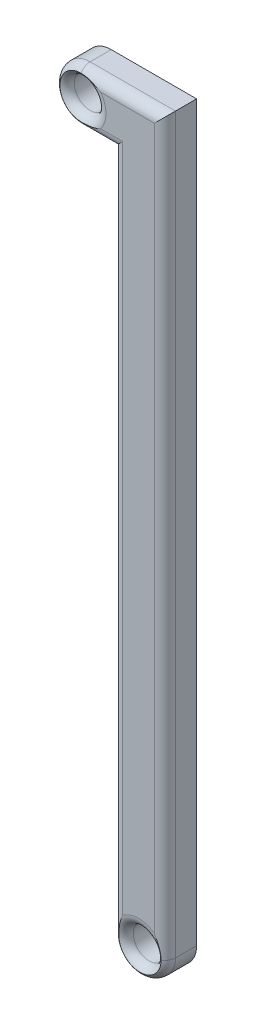
ISO-10303-21;
HEADER;
FILE_DESCRIPTION(('STEP AP214'),'2;1');
FILE_NAME('part.step','',(''),(''),'','','');
FILE_SCHEMA(('AUTOMOTIVE_DESIGN { 1 0 10303 214 1 1 1 1 }'));
ENDSEC;
DATA;
#1=APPLICATION_CONTEXT('core data for automotive mechanical design processes');
#2=APPLICATION_PROTOCOL_DEFINITION('international standard','automotive_design',2000,#1);
#3=PRODUCT_CONTEXT('',#1,'mechanical');
#4=PRODUCT('Part','Part','',(#3));
#5=PRODUCT_RELATED_PRODUCT_CATEGORY('part','',(#4));
#6=PRODUCT_DEFINITION_FORMATION('','',#4);
#7=PRODUCT_DEFINITION_CONTEXT('part definition',#1,'design');
#8=PRODUCT_DEFINITION('design','',#6,#7);
#9=PRODUCT_DEFINITION_SHAPE('','',#8);
#10=(LENGTH_UNIT() NAMED_UNIT(*) SI_UNIT(.MILLI.,.METRE.));
#11=(NAMED_UNIT(*) PLANE_ANGLE_UNIT() SI_UNIT($,.RADIAN.));
#12=(NAMED_UNIT(*) SI_UNIT($,.STERADIAN.) SOLID_ANGLE_UNIT());
#13=UNCERTAINTY_MEASURE_WITH_UNIT(LENGTH_MEASURE(1.E-05),#10,'distance_accuracy_value','');
#14=(GEOMETRIC_REPRESENTATION_CONTEXT(3) GLOBAL_UNCERTAINTY_ASSIGNED_CONTEXT((#13)) GLOBAL_UNIT_ASSIGNED_CONTEXT((#10,
#11,#12)) REPRESENTATION_CONTEXT('',''));
#15=CARTESIAN_POINT('',(0.,0.,0.));
#16=DIRECTION('',(0.,0.,1.));
#17=DIRECTION('',(1.,0.,0.));
#18=AXIS2_PLACEMENT_3D('',#15,#16,#17);
#19=CARTESIAN_POINT('',(3.23116737382815,-1.99988934751613,3.));
#20=DIRECTION('',(0.,0.,-1.));
#21=DIRECTION('',(-1.,0.,0.));
#22=AXIS2_PLACEMENT_3D('',#19,#20,#21);
#23=PLANE('',#22);
#24=DIRECTION('',(0.,1.,0.));
#25=VECTOR('',#24,1.);
#26=CARTESIAN_POINT('',(10.3211673738282,-1.99988934751613,3.));
#27=LINE('',#26,#25);
#28=CARTESIAN_POINT('',(10.3211673738282,-66.9998893475161,3.));
#29=VERTEX_POINT('',#28);
#30=CARTESIAN_POINT('',(10.3211673738282,-0.499889347516129,3.));
#31=VERTEX_POINT('',#30);
#32=EDGE_CURVE('E264',#29,#31,#27,.T.);
#33=ORIENTED_EDGE('',*,*,#32,.T.);
#34=DIRECTION('',(-1.,0.,0.));
#35=VECTOR('',#34,1.);
#36=CARTESIAN_POINT('',(3.23116737382815,-0.499889347516129,3.));
#37=LINE('',#36,#35);
#38=CARTESIAN_POINT('',(5.23116737382815,-0.499889347516129,3.));
#39=VERTEX_POINT('',#38);
#40=EDGE_CURVE('E266',#31,#39,#37,.T.);
#41=ORIENTED_EDGE('',*,*,#40,.T.);
#42=CARTESIAN_POINT('',(3.23116737382815,-1.99988934751613,3.));
#43=DIRECTION('',(0.,0.,-1.));
#44=DIRECTION('',(-1.,0.,0.));
#45=AXIS2_PLACEMENT_3D('',#42,#43,#44);
#46=CIRCLE('',#45,2.5);
#47=CARTESIAN_POINT('',(5.23116737382815,-3.49988934751613,3.));
#48=VERTEX_POINT('',#47);
#49=EDGE_CURVE('E259',#39,#48,#46,.T.);
#50=ORIENTED_EDGE('',*,*,#49,.T.);
#51=DIRECTION('',(1.,0.,0.));
#52=VECTOR('',#51,1.);
#53=CARTESIAN_POINT('',(3.23116737382815,-3.49988934751613,3.));
#54=LINE('',#53,#52);
#55=CARTESIAN_POINT('',(7.32116737382815,-3.49988934751613,3.));
#56=VERTEX_POINT('',#55);
#57=EDGE_CURVE('E255',#48,#56,#54,.T.);
#58=ORIENTED_EDGE('',*,*,#57,.T.);
#59=DIRECTION('',(0.,-1.,0.));
#60=VECTOR('',#59,1.);
#61=CARTESIAN_POINT('',(7.32116737382815,-1.99988934751613,3.));
#62=LINE('',#61,#60);
#63=CARTESIAN_POINT('',(7.32116737382816,-66.9998893475161,3.));
#64=VERTEX_POINT('',#63);
#65=EDGE_CURVE('E257',#56,#64,#62,.T.);
#66=ORIENTED_EDGE('',*,*,#65,.T.);
#67=CARTESIAN_POINT('',(8.82116737382816,-68.9998893475161,3.));
#68=DIRECTION('',(0.,0.,-1.));
#69=DIRECTION('',(-1.,0.,0.));
#70=AXIS2_PLACEMENT_3D('',#67,#68,#69);
#71=CIRCLE('',#70,2.5);
#72=EDGE_CURVE('E261',#64,#29,#71,.T.);
#73=ORIENTED_EDGE('',*,*,#72,.T.);
#74=EDGE_LOOP('',(#33,#41,#50,#58,#66,#73));
#75=FACE_BOUND('',#74,.T.);
#76=ADVANCED_FACE('F33',(#75),#23,.F.);
#77=CARTESIAN_POINT('',(3.23116737382815,-1.99988934751613,0.));
#78=DIRECTION('',(0.,0.,-1.));
#79=DIRECTION('',(-1.,0.,0.));
#80=AXIS2_PLACEMENT_3D('',#77,#78,#79);
#81=PLANE('',#80);
#82=CARTESIAN_POINT('',(3.23116737382815,-1.99988934751613,0.));
#83=DIRECTION('',(0.,0.,1.));
#84=DIRECTION('',(1.,0.,0.));
#85=AXIS2_PLACEMENT_3D('',#82,#83,#84);
#86=CIRCLE('',#85,1.5);
#87=CARTESIAN_POINT('',(4.73116737382815,-1.99988934751613,0.));
#88=VERTEX_POINT('',#87);
#89=EDGE_CURVE('E296',#88,#88,#86,.T.);
#90=ORIENTED_EDGE('',*,*,#89,.T.);
#91=EDGE_LOOP('',(#90));
#92=FACE_BOUND('',#91,.T.);
#93=CARTESIAN_POINT('',(3.23116737382815,-1.99988934751613,0.));
#94=DIRECTION('',(0.,0.,1.));
#95=DIRECTION('',(-1.,0.,0.));
#96=AXIS2_PLACEMENT_3D('',#93,#94,#95);
#97=CIRCLE('',#96,2.5);
#98=CARTESIAN_POINT('',(3.23116737382815,0.500110652483871,0.));
#99=VERTEX_POINT('',#98);
#100=CARTESIAN_POINT('',(3.23116737382815,-4.49988934751613,0.));
#101=VERTEX_POINT('',#100);
#102=EDGE_CURVE('E299',#99,#101,#97,.T.);
#103=ORIENTED_EDGE('',*,*,#102,.F.);
#104=DIRECTION('',(-1.,0.,0.));
#105=VECTOR('',#104,1.);
#106=CARTESIAN_POINT('',(3.23116737382815,0.500110652483871,0.));
#107=LINE('',#106,#105);
#108=CARTESIAN_POINT('',(11.3211673738282,0.500110652483871,0.));
#109=VERTEX_POINT('',#108);
#110=EDGE_CURVE('E240',#109,#99,#107,.T.);
#111=ORIENTED_EDGE('',*,*,#110,.F.);
#112=DIRECTION('',(0.,1.,0.));
#113=VECTOR('',#112,1.);
#114=CARTESIAN_POINT('',(11.3211673738282,0.500110652483871,0.));
#115=LINE('',#114,#113);
#116=CARTESIAN_POINT('',(11.3211673738282,-68.9998893475161,0.));
#117=VERTEX_POINT('',#116);
#118=EDGE_CURVE('E245',#117,#109,#115,.T.);
#119=ORIENTED_EDGE('',*,*,#118,.F.);
#120=CARTESIAN_POINT('',(8.82116737382816,-68.9998893475161,0.));
#121=DIRECTION('',(0.,0.,1.));
#122=DIRECTION('',(1.,0.,0.));
#123=AXIS2_PLACEMENT_3D('',#120,#121,#122);
#124=CIRCLE('',#123,2.5);
#125=CARTESIAN_POINT('',(6.32116737382816,-68.9998893475161,0.));
#126=VERTEX_POINT('',#125);
#127=EDGE_CURVE('E306',#126,#117,#124,.T.);
#128=ORIENTED_EDGE('',*,*,#127,.F.);
#129=DIRECTION('',(0.,-1.,0.));
#130=VECTOR('',#129,1.);
#131=CARTESIAN_POINT('',(6.32116737382815,-4.49988934751613,0.));
#132=LINE('',#131,#130);
#133=CARTESIAN_POINT('',(6.32116737382815,-4.49988934751613,0.));
#134=VERTEX_POINT('',#133);
#135=EDGE_CURVE('E139',#134,#126,#132,.T.);
#136=ORIENTED_EDGE('',*,*,#135,.F.);
#137=DIRECTION('',(1.,0.,0.));
#138=VECTOR('',#137,1.);
#139=CARTESIAN_POINT('',(3.23116737382815,-4.49988934751613,0.));
#140=LINE('',#139,#138);
#141=EDGE_CURVE('E303',#101,#134,#140,.T.);
#142=ORIENTED_EDGE('',*,*,#141,.F.);
#143=EDGE_LOOP('',(#103,#111,#119,#128,#136,#142));
#144=FACE_BOUND('',#143,.T.);
#145=CARTESIAN_POINT('',(8.82116737382816,-68.9998893475161,0.));
#146=DIRECTION('',(0.,0.,1.));
#147=DIRECTION('',(1.,0.,0.));
#148=AXIS2_PLACEMENT_3D('',#145,#146,#147);
#149=CIRCLE('',#148,1.5);
#150=CARTESIAN_POINT('',(10.3211673738282,-68.9998893475161,0.));
#151=VERTEX_POINT('',#150);
#152=EDGE_CURVE('E294',#151,#151,#149,.T.);
#153=ORIENTED_EDGE('',*,*,#152,.T.);
#154=EDGE_LOOP('',(#153));
#155=FACE_BOUND('',#154,.T.);
#156=ADVANCED_FACE('F309',(#92,#144,#155),#81,.T.);
#157=CARTESIAN_POINT('',(3.23116737382815,-1.99988934751613,3.));
#158=DIRECTION('',(0.,0.,-1.));
#159=DIRECTION('',(-1.,0.,0.));
#160=AXIS2_PLACEMENT_3D('',#157,#158,#159);
#161=CYLINDRICAL_SURFACE('',#160,2.5);
#162=DIRECTION('',(0.,0.,-1.));
#163=VECTOR('',#162,1.);
#164=CARTESIAN_POINT('',(3.23116737382815,-4.49988934751613,3.));
#165=LINE('',#164,#163);
#166=CARTESIAN_POINT('',(3.23116737382815,-4.49988934751613,2.));
#167=VERTEX_POINT('',#166);
#168=EDGE_CURVE('E76',#167,#101,#165,.T.);
#169=ORIENTED_EDGE('',*,*,#168,.F.);
#170=CARTESIAN_POINT('',(3.23116737382815,-1.99988934751613,2.));
#171=DIRECTION('',(0.,0.,-1.));
#172=DIRECTION('',(-1.,0.,0.));
#173=AXIS2_PLACEMENT_3D('',#170,#171,#172);
#174=CIRCLE('',#173,2.5);
#175=CARTESIAN_POINT('',(3.23116737382815,0.500110652483871,2.));
#176=VERTEX_POINT('',#175);
#177=EDGE_CURVE('E11',#167,#176,#174,.T.);
#178=ORIENTED_EDGE('',*,*,#177,.T.);
#179=DIRECTION('',(0.,0.,-1.));
#180=VECTOR('',#179,1.);
#181=CARTESIAN_POINT('',(3.23116737382815,0.500110652483871,3.));
#182=LINE('',#181,#180);
#183=EDGE_CURVE('E232',#176,#99,#182,.T.);
#184=ORIENTED_EDGE('',*,*,#183,.T.);
#185=ORIENTED_EDGE('',*,*,#102,.T.);
#186=EDGE_LOOP('',(#169,#178,#184,#185));
#187=FACE_BOUND('',#186,.T.);
#188=ADVANCED_FACE('F230',(#187),#161,.T.);
#189=CARTESIAN_POINT('',(3.23116737382815,-4.49988934751613,3.));
#190=DIRECTION('',(0.,1.,0.));
#191=DIRECTION('',(0.,0.,1.));
#192=AXIS2_PLACEMENT_3D('',#189,#190,#191);
#193=PLANE('',#192);
#194=DIRECTION('',(0.,0.,-1.));
#195=VECTOR('',#194,1.);
#196=CARTESIAN_POINT('',(6.32116737382815,-4.49988934751613,3.));
#197=LINE('',#196,#195);
#198=CARTESIAN_POINT('',(6.32116737382815,-4.49988934751613,2.));
#199=VERTEX_POINT('',#198);
#200=EDGE_CURVE('E141',#199,#134,#197,.T.);
#201=ORIENTED_EDGE('',*,*,#200,.F.);
#202=DIRECTION('',(1.,0.,0.));
#203=VECTOR('',#202,1.);
#204=CARTESIAN_POINT('',(3.23116737382815,-4.49988934751613,2.));
#205=LINE('',#204,#203);
#206=EDGE_CURVE('E43',#199,#167,#205,.F.);
#207=ORIENTED_EDGE('',*,*,#206,.T.);
#208=ORIENTED_EDGE('',*,*,#168,.T.);
#209=ORIENTED_EDGE('',*,*,#141,.T.);
#210=EDGE_LOOP('',(#201,#207,#208,#209));
#211=FACE_BOUND('',#210,.T.);
#212=ADVANCED_FACE('F310',(#211),#193,.F.);
#213=CARTESIAN_POINT('',(6.32116737382815,-4.49988934751613,3.));
#214=DIRECTION('',(1.,0.,0.));
#215=DIRECTION('',(0.,1.,0.));
#216=AXIS2_PLACEMENT_3D('',#213,#214,#215);
#217=PLANE('',#216);
#218=DIRECTION('',(0.,0.,-1.));
#219=VECTOR('',#218,1.);
#220=CARTESIAN_POINT('',(6.32116737382816,-68.9998893475161,3.));
#221=LINE('',#220,#219);
#222=CARTESIAN_POINT('',(6.32116737382816,-68.9998893475161,2.));
#223=VERTEX_POINT('',#222);
#224=EDGE_CURVE('E126',#223,#126,#221,.T.);
#225=ORIENTED_EDGE('',*,*,#224,.F.);
#226=DIRECTION('',(0.,-1.,0.));
#227=VECTOR('',#226,1.);
#228=CARTESIAN_POINT('',(6.32116737382815,-4.49988934751613,2.));
#229=LINE('',#228,#227);
#230=EDGE_CURVE('E132',#223,#199,#229,.F.);
#231=ORIENTED_EDGE('',*,*,#230,.T.);
#232=ORIENTED_EDGE('',*,*,#200,.T.);
#233=ORIENTED_EDGE('',*,*,#135,.T.);
#234=EDGE_LOOP('',(#225,#231,#232,#233));
#235=FACE_BOUND('',#234,.T.);
#236=ADVANCED_FACE('F136',(#235),#217,.F.);
#237=CARTESIAN_POINT('',(8.82116737382816,-68.9998893475161,3.));
#238=DIRECTION('',(0.,0.,-1.));
#239=DIRECTION('',(-1.,0.,0.));
#240=AXIS2_PLACEMENT_3D('',#237,#238,#239);
#241=CYLINDRICAL_SURFACE('',#240,2.5);
#242=DIRECTION('',(0.,0.,-1.));
#243=VECTOR('',#242,1.);
#244=CARTESIAN_POINT('',(11.3211673738282,-68.9998893475161,3.));
#245=LINE('',#244,#243);
#246=CARTESIAN_POINT('',(11.3211673738282,-68.9998893475161,2.));
#247=VERTEX_POINT('',#246);
#248=EDGE_CURVE('E128',#247,#117,#245,.T.);
#249=ORIENTED_EDGE('',*,*,#248,.F.);
#250=CARTESIAN_POINT('',(8.82116737382816,-68.9998893475161,2.));
#251=DIRECTION('',(0.,0.,-1.));
#252=DIRECTION('',(-1.,0.,0.));
#253=AXIS2_PLACEMENT_3D('',#250,#251,#252);
#254=CIRCLE('',#253,2.5);
#255=EDGE_CURVE('E122',#247,#223,#254,.T.);
#256=ORIENTED_EDGE('',*,*,#255,.T.);
#257=ORIENTED_EDGE('',*,*,#224,.T.);
#258=ORIENTED_EDGE('',*,*,#127,.T.);
#259=EDGE_LOOP('',(#249,#256,#257,#258));
#260=FACE_BOUND('',#259,.T.);
#261=ADVANCED_FACE('F124',(#260),#241,.T.);
#262=CARTESIAN_POINT('',(11.3211673738282,0.500110652483871,3.));
#263=DIRECTION('',(-1.,0.,0.));
#264=DIRECTION('',(0.,-1.,0.));
#265=AXIS2_PLACEMENT_3D('',#262,#263,#264);
#266=PLANE('',#265);
#267=DIRECTION('',(0.,0.,-1.));
#268=VECTOR('',#267,1.);
#269=CARTESIAN_POINT('',(11.3211673738282,0.500110652483871,3.));
#270=LINE('',#269,#268);
#271=CARTESIAN_POINT('',(11.3211673738282,0.500110652483871,2.));
#272=VERTEX_POINT('',#271);
#273=EDGE_CURVE('E242',#272,#109,#270,.T.);
#274=ORIENTED_EDGE('',*,*,#273,.F.);
#275=DIRECTION('',(0.,1.,0.));
#276=VECTOR('',#275,1.);
#277=CARTESIAN_POINT('',(11.3211673738282,0.500110652483871,2.));
#278=LINE('',#277,#276);
#279=EDGE_CURVE('E133',#272,#247,#278,.F.);
#280=ORIENTED_EDGE('',*,*,#279,.T.);
#281=ORIENTED_EDGE('',*,*,#248,.T.);
#282=ORIENTED_EDGE('',*,*,#118,.T.);
#283=EDGE_LOOP('',(#274,#280,#281,#282));
#284=FACE_BOUND('',#283,.T.);
#285=ADVANCED_FACE('F272',(#284),#266,.F.);
#286=CARTESIAN_POINT('',(3.23116737382815,0.500110652483871,3.));
#287=DIRECTION('',(0.,-1.,0.));
#288=DIRECTION('',(0.,0.,-1.));
#289=AXIS2_PLACEMENT_3D('',#286,#287,#288);
#290=PLANE('',#289);
#291=ORIENTED_EDGE('',*,*,#183,.F.);
#292=DIRECTION('',(-1.,0.,0.));
#293=VECTOR('',#292,1.);
#294=CARTESIAN_POINT('',(3.23116737382815,0.500110652483871,2.));
#295=LINE('',#294,#293);
#296=EDGE_CURVE('E237',#176,#272,#295,.F.);
#297=ORIENTED_EDGE('',*,*,#296,.T.);
#298=ORIENTED_EDGE('',*,*,#273,.T.);
#299=ORIENTED_EDGE('',*,*,#110,.T.);
#300=EDGE_LOOP('',(#291,#297,#298,#299));
#301=FACE_BOUND('',#300,.T.);
#302=ADVANCED_FACE('F236',(#301),#290,.F.);
#303=CARTESIAN_POINT('',(3.23116737382815,-1.99988934751613,3.));
#304=DIRECTION('',(0.,0.,-1.));
#305=DIRECTION('',(-1.,0.,0.));
#306=AXIS2_PLACEMENT_3D('',#303,#304,#305);
#307=CYLINDRICAL_SURFACE('',#306,1.5);
#308=CARTESIAN_POINT('',(3.23116737382815,-1.99988934751613,2.));
#309=DIRECTION('',(0.,0.,-1.));
#310=DIRECTION('',(-1.,0.,0.));
#311=AXIS2_PLACEMENT_3D('',#308,#309,#310);
#312=CIRCLE('',#311,1.5);
#313=CARTESIAN_POINT('',(1.73116737382815,-1.99988934751613,2.));
#314=VERTEX_POINT('',#313);
#315=EDGE_CURVE('E268',#314,#314,#312,.F.);
#316=ORIENTED_EDGE('',*,*,#315,.T.);
#317=EDGE_LOOP('',(#316));
#318=FACE_BOUND('',#317,.T.);
#319=ORIENTED_EDGE('',*,*,#89,.F.);
#320=EDGE_LOOP('',(#319));
#321=FACE_BOUND('',#320,.T.);
#322=ADVANCED_FACE('F290',(#318,#321),#307,.F.);
#323=CARTESIAN_POINT('',(8.82116737382816,-68.9998893475161,3.));
#324=DIRECTION('',(0.,0.,-1.));
#325=DIRECTION('',(-1.,0.,0.));
#326=AXIS2_PLACEMENT_3D('',#323,#324,#325);
#327=CYLINDRICAL_SURFACE('',#326,1.5);
#328=CARTESIAN_POINT('',(8.82116737382816,-68.9998893475161,2.));
#329=DIRECTION('',(0.,0.,-1.));
#330=DIRECTION('',(-1.,0.,0.));
#331=AXIS2_PLACEMENT_3D('',#328,#329,#330);
#332=CIRCLE('',#331,1.5);
#333=CARTESIAN_POINT('',(7.32116737382816,-68.9998893475161,2.));
#334=VERTEX_POINT('',#333);
#335=EDGE_CURVE('E252',#334,#334,#332,.F.);
#336=ORIENTED_EDGE('',*,*,#335,.T.);
#337=EDGE_LOOP('',(#336));
#338=FACE_BOUND('',#337,.T.);
#339=ORIENTED_EDGE('',*,*,#152,.F.);
#340=EDGE_LOOP('',(#339));
#341=FACE_BOUND('',#340,.T.);
#342=ADVANCED_FACE('F287',(#338,#341),#327,.F.);
#343=CARTESIAN_POINT('',(3.23116737382815,-1.99988934751613,2.));
#344=DIRECTION('',(0.,0.,-1.));
#345=DIRECTION('',(-1.,0.,0.));
#346=AXIS2_PLACEMENT_3D('',#343,#344,#345);
#347=TOROIDAL_SURFACE('',#346,1.5,1.);
#348=CARTESIAN_POINT('',(3.23116737382815,-1.99988934751613,2.86602540378444));
#349=DIRECTION('',(0.,0.,1.));
#350=DIRECTION('',(1.,0.,0.));
#351=AXIS2_PLACEMENT_3D('',#348,#349,#350);
#352=CIRCLE('',#351,2.);
#353=CARTESIAN_POINT('',(3.23116737382815,0.00011065248387216,2.86602540378444));
#354=VERTEX_POINT('',#353);
#355=CARTESIAN_POINT('',(3.23116737382815,-3.99988934751613,2.86602540378444));
#356=VERTEX_POINT('',#355);
#357=EDGE_CURVE('E37',#354,#356,#352,.T.);
#358=ORIENTED_EDGE('',*,*,#357,.F.);
#359=CARTESIAN_POINT('',(3.23116737382815,-0.499889347516129,2.));
#360=DIRECTION('',(1.,0.,0.));
#361=DIRECTION('',(0.,0.,-1.));
#362=AXIS2_PLACEMENT_3D('',#359,#360,#361);
#363=CIRCLE('',#362,1.);
#364=EDGE_CURVE('E221',#176,#354,#363,.T.);
#365=ORIENTED_EDGE('',*,*,#364,.F.);
#366=ORIENTED_EDGE('',*,*,#177,.F.);
#367=CARTESIAN_POINT('',(3.23116737382815,-3.49988934751613,2.));
#368=DIRECTION('',(1.,0.,0.));
#369=DIRECTION('',(0.,0.,-1.));
#370=AXIS2_PLACEMENT_3D('',#367,#368,#369);
#371=CIRCLE('',#370,1.);
#372=EDGE_CURVE('E202',#356,#167,#371,.T.);
#373=ORIENTED_EDGE('',*,*,#372,.F.);
#374=EDGE_LOOP('',(#358,#365,#366,#373));
#375=FACE_BOUND('',#374,.T.);
#376=ADVANCED_FACE('F35',(#375),#347,.T.);
#377=CARTESIAN_POINT('',(3.23116737382815,-1.99988934751613,2.));
#378=DIRECTION('',(0.,0.,-1.));
#379=DIRECTION('',(-1.,0.,0.));
#380=AXIS2_PLACEMENT_3D('',#377,#378,#379);
#381=TOROIDAL_SURFACE('',#380,2.5,1.);
#382=ORIENTED_EDGE('',*,*,#315,.F.);
#383=EDGE_LOOP('',(#382));
#384=FACE_BOUND('',#383,.T.);
#385=CARTESIAN_POINT('',(3.23096737382815,-3.99988934251613,2.86602540667119));
#386=CARTESIAN_POINT('',(3.28495506493627,-3.99989520057503,2.86601083367114));
#387=CARTESIAN_POINT('',(3.33893971221258,-3.99880184109803,2.86665306079238));
#388=CARTESIAN_POINT('',(3.44678091272652,-3.99444070253498,2.86915498711415));
#389=CARTESIAN_POINT('',(3.50063749249651,-3.99117342207617,2.8710144071284));
#390=CARTESIAN_POINT('',(3.60803712559681,-3.98249557134266,2.87585069683843));
#391=CARTESIAN_POINT('',(3.66158054862418,-3.97708853062233,2.87882572590525));
#392=CARTESIAN_POINT('',(3.76835141509654,-3.96417489152214,2.88571571883685));
#393=CARTESIAN_POINT('',(3.82157884308776,-3.95666819130805,2.8896307282897));
#394=CARTESIAN_POINT('',(3.98043990972291,-3.93111214209728,2.90244796794199));
#395=CARTESIAN_POINT('',(4.08550561363242,-3.91000596250776,2.91243570662408));
#396=CARTESIAN_POINT('',(4.2937076182005,-3.8601212875348,2.93325199781923));
#397=CARTESIAN_POINT('',(4.39684357787235,-3.83134144966101,2.94408069722143));
#398=CARTESIAN_POINT('',(4.56115499358438,-3.77926524783986,2.96040447896624));
#399=CARTESIAN_POINT('',(4.62300436662475,-3.75820937322137,2.96633232750255));
#400=CARTESIAN_POINT('',(4.74585727088061,-3.71357566212273,2.97717224301163));
#401=CARTESIAN_POINT('',(4.80686092443948,-3.68999819481357,2.98208445836902));
#402=CARTESIAN_POINT('',(4.98839559852232,-3.61573397574221,2.99453386944158));
#403=CARTESIAN_POINT('',(5.10768380403624,-3.56144055770072,2.99981076244455));
#404=CARTESIAN_POINT('',(5.22695036133237,-3.50199619202414,2.99999833026908));
#405=CARTESIAN_POINT('',(5.22905921444634,-3.50094343225584,2.99999999676168));
#406=CARTESIAN_POINT('',(5.23116737382815,-3.49988934751613,3.));
#407=B_SPLINE_CURVE_WITH_KNOTS('',3,(#385,#386,#387,#388,#389,#390,#391,#392,#393,#394,#395,
#396,#397,#398,#399,#400,#401,#402,#403,#404,#405,#406),.UNSPECIFIED.,.F.,.F.,(4,2,2,2,2,2,2,2,
2,2,4),(0.,0.161943005579269,0.32384887946429,0.485488793912951,0.647136549314659,
0.969671018314064,1.29226195110516,1.48901141462259,1.68573211258137,2.0784357117688,
2.08550678275551),.UNSPECIFIED.);
#408=EDGE_CURVE('E193',#48,#356,#407,.F.);
#409=ORIENTED_EDGE('',*,*,#408,.F.);
#410=ORIENTED_EDGE('',*,*,#49,.F.);
#411=CARTESIAN_POINT('',(5.23116737382815,-0.499889347516129,3.));
#412=CARTESIAN_POINT('',(5.22905922775225,-0.498835259790567,2.9999999940597));
#413=CARTESIAN_POINT('',(5.22695037480656,-0.497782500171374,2.99999832762934));
#414=CARTESIAN_POINT('',(5.00326945097424,-0.386297351856553,2.99964683182961));
#415=CARTESIAN_POINT('',(4.77392490262747,-0.290556112160958,2.98111211959676));
#416=CARTESIAN_POINT('',(4.42180759700905,-0.175349120905638,2.94672662718851));
#417=CARTESIAN_POINT('',(4.30290094934548,-0.141651875201965,2.93414376133096));
#418=CARTESIAN_POINT('',(4.06255180951751,-0.0844929446352769,2.91016928917787));
#419=CARTESIAN_POINT('',(3.9411121556888,-0.0610203869376389,2.89877642729608));
#420=CARTESIAN_POINT('',(3.72157147647551,-0.0287709902663164,2.88221740814726));
#421=CARTESIAN_POINT('',(3.6238296087175,-0.0179603848628386,2.87625124658861));
#422=CARTESIAN_POINT('',(3.47674435204242,-0.00712739263735896,2.87017308801062));
#423=CARTESIAN_POINT('',(3.4276494782037,-0.00441355411726191,2.8686255773568));
#424=CARTESIAN_POINT('',(3.32936056049334,-0.00079223543231598,2.8665472494052));
#425=CARTESIAN_POINT('',(3.28016649629332,0.000114826377070569,2.86601666757628));
#426=CARTESIAN_POINT('',(3.23096737382816,0.000110647484013651,2.86602540667132));
#427=B_SPLINE_CURVE_WITH_KNOTS('',3,(#411,#412,#413,#414,#415,#416,#417,#418,#419,#420,#421,
#422,#423,#424,#425,#426),.UNSPECIFIED.,.F.,.F.,(4,2,2,2,2,2,2,4),(0.,0.0070710709867117,
0.749760858527406,1.12222276075045,1.49428761789551,1.789519357141,1.93706174397478,
2.08463828997787),.UNSPECIFIED.);
#428=EDGE_CURVE('E215',#354,#39,#427,.F.);
#429=ORIENTED_EDGE('',*,*,#428,.F.);
#430=ORIENTED_EDGE('',*,*,#357,.T.);
#431=EDGE_LOOP('',(#409,#410,#429,#430));
#432=FACE_BOUND('',#431,.T.);
#433=ADVANCED_FACE('F204',(#384,#432),#381,.T.);
#434=CARTESIAN_POINT('',(3.23116737382815,-0.499889347516129,2.));
#435=DIRECTION('',(-1.,0.,0.));
#436=DIRECTION('',(0.,0.,1.));
#437=AXIS2_PLACEMENT_3D('',#434,#435,#436);
#438=CYLINDRICAL_SURFACE('',#437,1.);
#439=ORIENTED_EDGE('',*,*,#428,.T.);
#440=ORIENTED_EDGE('',*,*,#40,.F.);
#441=CARTESIAN_POINT('',(10.3211673738282,-0.499889347516129,2.));
#442=DIRECTION('',(-0.707106781186548,0.707106781186547,0.));
#443=DIRECTION('',(0.707106781186547,0.707106781186548,0.));
#444=AXIS2_PLACEMENT_3D('',#441,#442,#443);
#445=ELLIPSE('',#444,1.41421356237309,1.);
#446=EDGE_CURVE('E190',#272,#31,#445,.F.);
#447=ORIENTED_EDGE('',*,*,#446,.F.);
#448=ORIENTED_EDGE('',*,*,#296,.F.);
#449=ORIENTED_EDGE('',*,*,#364,.T.);
#450=EDGE_LOOP('',(#439,#440,#447,#448,#449));
#451=FACE_BOUND('',#450,.T.);
#452=ADVANCED_FACE('F212',(#451),#438,.T.);
#453=CARTESIAN_POINT('',(3.23116737382815,-3.49988934751613,2.));
#454=DIRECTION('',(1.,0.,0.));
#455=DIRECTION('',(0.,0.,-1.));
#456=AXIS2_PLACEMENT_3D('',#453,#454,#455);
#457=CYLINDRICAL_SURFACE('',#456,1.);
#458=ORIENTED_EDGE('',*,*,#372,.T.);
#459=ORIENTED_EDGE('',*,*,#206,.F.);
#460=CARTESIAN_POINT('',(7.32116737382815,-3.49988934751613,2.));
#461=DIRECTION('',(0.707106781186548,-0.707106781186547,0.));
#462=DIRECTION('',(-0.707106781186547,-0.707106781186548,0.));
#463=AXIS2_PLACEMENT_3D('',#460,#461,#462);
#464=ELLIPSE('',#463,1.41421356237309,1.);
#465=EDGE_CURVE('E152',#56,#199,#464,.T.);
#466=ORIENTED_EDGE('',*,*,#465,.F.);
#467=ORIENTED_EDGE('',*,*,#57,.F.);
#468=ORIENTED_EDGE('',*,*,#408,.T.);
#469=EDGE_LOOP('',(#458,#459,#466,#467,#468));
#470=FACE_BOUND('',#469,.T.);
#471=ADVANCED_FACE('F209',(#470),#457,.T.);
#472=CARTESIAN_POINT('',(10.3211673738282,-1.99988934751613,2.));
#473=DIRECTION('',(0.,1.,0.));
#474=DIRECTION('',(-1.,0.,0.));
#475=AXIS2_PLACEMENT_3D('',#472,#473,#474);
#476=CYLINDRICAL_SURFACE('',#475,1.);
#477=CARTESIAN_POINT('',(10.3211673738282,-68.9998893475161,2.));
#478=DIRECTION('',(0.,-1.,0.));
#479=DIRECTION('',(0.,0.,-1.));
#480=AXIS2_PLACEMENT_3D('',#477,#478,#479);
#481=CIRCLE('',#480,1.);
#482=CARTESIAN_POINT('',(10.8211673738282,-68.9998893475161,2.86602540378444));
#483=VERTEX_POINT('',#482);
#484=EDGE_CURVE('E151',#247,#483,#481,.T.);
#485=ORIENTED_EDGE('',*,*,#484,.F.);
#486=ORIENTED_EDGE('',*,*,#279,.F.);
#487=ORIENTED_EDGE('',*,*,#446,.T.);
#488=ORIENTED_EDGE('',*,*,#32,.F.);
#489=CARTESIAN_POINT('',(10.8211673688282,-69.0000893475161,2.86602540667119));
#490=CARTESIAN_POINT('',(10.8211732268871,-68.946101656408,2.86601083367114));
#491=CARTESIAN_POINT('',(10.8200798674101,-68.8921170091317,2.86665306079237));
#492=CARTESIAN_POINT('',(10.815718728847,-68.7842758086177,2.86915498711415));
#493=CARTESIAN_POINT('',(10.8124514483882,-68.7304192288477,2.8710144071284));
#494=CARTESIAN_POINT('',(10.8037735976547,-68.6230195957474,2.87585069683844));
#495=CARTESIAN_POINT('',(10.7983665569343,-68.56947617272,2.87882572590526));
#496=CARTESIAN_POINT('',(10.7854529178341,-68.4627053062476,2.88571571883686));
#497=CARTESIAN_POINT('',(10.7779462176201,-68.4094778782564,2.88963072828972));
#498=CARTESIAN_POINT('',(10.7523901684093,-68.2506168116212,2.90244796794201));
#499=CARTESIAN_POINT('',(10.7312839888198,-68.1455511077118,2.91243570662409));
#500=CARTESIAN_POINT('',(10.6813993138468,-67.9373491031437,2.93325199781924));
#501=CARTESIAN_POINT('',(10.652619475973,-67.8342131434719,2.94408069722144));
#502=CARTESIAN_POINT('',(10.6005432741519,-67.6699017277599,2.96040447896624));
#503=CARTESIAN_POINT('',(10.5794873995334,-67.6080523547195,2.96633232750254));
#504=CARTESIAN_POINT('',(10.5348536884348,-67.4851994504637,2.97717224301163));
#505=CARTESIAN_POINT('',(10.5112762211256,-67.4241957969048,2.98208445836903));
#506=CARTESIAN_POINT('',(10.4370120020542,-67.242661122822,2.99453386944155));
#507=CARTESIAN_POINT('',(10.3827185840126,-67.1233729173081,2.99981076244444));
#508=CARTESIAN_POINT('',(10.3232742183362,-67.0041063600119,2.99999833026908));
#509=CARTESIAN_POINT('',(10.3222214585679,-67.001997506898,2.99999999676169));
#510=CARTESIAN_POINT('',(10.3211673738282,-66.9998893475161,3.00000000000001));
#511=B_SPLINE_CURVE_WITH_KNOTS('',3,(#489,#490,#491,#492,#493,#494,#495,#496,#497,#498,#499,
#500,#501,#502,#503,#504,#505,#506,#507,#508,#509,#510),.UNSPECIFIED.,.F.,.F.,(4,2,2,2,2,2,2,2,
2,2,4),(0.,0.161943005579309,0.323848879464388,0.48548879391311,0.647136549314845,
0.969671018314145,1.29226195110515,1.48901141462258,1.68573211258135,2.07843571176881,
2.08550678275552),.UNSPECIFIED.);
#512=EDGE_CURVE('E182',#483,#29,#511,.T.);
#513=ORIENTED_EDGE('',*,*,#512,.F.);
#514=EDGE_LOOP('',(#485,#486,#487,#488,#513));
#515=FACE_BOUND('',#514,.T.);
#516=ADVANCED_FACE('F179',(#515),#476,.T.);
#517=CARTESIAN_POINT('',(8.82116737382816,-68.9998893475161,2.));
#518=DIRECTION('',(0.,0.,-1.));
#519=DIRECTION('',(-1.,0.,0.));
#520=AXIS2_PLACEMENT_3D('',#517,#518,#519);
#521=TOROIDAL_SURFACE('',#520,1.5,1.);
#522=CARTESIAN_POINT('',(7.32116737382816,-68.9998893475161,2.));
#523=DIRECTION('',(0.,1.,0.));
#524=DIRECTION('',(0.,0.,1.));
#525=AXIS2_PLACEMENT_3D('',#522,#523,#524);
#526=CIRCLE('',#525,1.);
#527=CARTESIAN_POINT('',(6.82116737382816,-68.9998893475161,2.86602540378444));
#528=VERTEX_POINT('',#527);
#529=EDGE_CURVE('E144',#223,#528,#526,.T.);
#530=ORIENTED_EDGE('',*,*,#529,.F.);
#531=ORIENTED_EDGE('',*,*,#255,.F.);
#532=ORIENTED_EDGE('',*,*,#484,.T.);
#533=CARTESIAN_POINT('',(8.82116737382816,-68.9998893475161,2.86602540378444));
#534=DIRECTION('',(0.,0.,1.));
#535=DIRECTION('',(1.,0.,0.));
#536=AXIS2_PLACEMENT_3D('',#533,#534,#535);
#537=CIRCLE('',#536,2.);
#538=EDGE_CURVE('E147',#528,#483,#537,.T.);
#539=ORIENTED_EDGE('',*,*,#538,.F.);
#540=EDGE_LOOP('',(#530,#531,#532,#539));
#541=FACE_BOUND('',#540,.T.);
#542=ADVANCED_FACE('F145',(#541),#521,.T.);
#543=CARTESIAN_POINT('',(7.32116737382815,-1.99988934751613,2.));
#544=DIRECTION('',(0.,-1.,0.));
#545=DIRECTION('',(1.,0.,0.));
#546=AXIS2_PLACEMENT_3D('',#543,#544,#545);
#547=CYLINDRICAL_SURFACE('',#546,1.);
#548=ORIENTED_EDGE('',*,*,#230,.F.);
#549=ORIENTED_EDGE('',*,*,#529,.T.);
#550=CARTESIAN_POINT('',(7.32116737382816,-66.9998893475161,3.00000000000001));
#551=CARTESIAN_POINT('',(7.3201132861026,-67.001997493592,2.9999999940597));
#552=CARTESIAN_POINT('',(7.31906052648341,-67.0041063465377,2.99999832762934));
#553=CARTESIAN_POINT('',(7.20757537816856,-67.22778727037,2.9996468318294));
#554=CARTESIAN_POINT('',(7.11183413847298,-67.4571318187168,2.98111211959672));
#555=CARTESIAN_POINT('',(6.99662714721766,-67.8092491243353,2.94672662718852));
#556=CARTESIAN_POINT('',(6.96292990151399,-67.9281557719988,2.93414376133096));
#557=CARTESIAN_POINT('',(6.9057709709473,-68.1685049118268,2.91016928917786));
#558=CARTESIAN_POINT('',(6.88229841324967,-68.2899445656555,2.89877642729608));
#559=CARTESIAN_POINT('',(6.85004901657835,-68.5094852448688,2.88221740814726));
#560=CARTESIAN_POINT('',(6.83923841117487,-68.6072271126268,2.87625124658861));
#561=CARTESIAN_POINT('',(6.82840541894939,-68.7543123693019,2.87017308801062));
#562=CARTESIAN_POINT('',(6.82569158042929,-68.8034072431406,2.8686255773568));
#563=CARTESIAN_POINT('',(6.82207026174435,-68.901696160851,2.8665472494052));
#564=CARTESIAN_POINT('',(6.82116319993496,-68.950890225051,2.86601666757628));
#565=CARTESIAN_POINT('',(6.82116737882802,-69.0000893475161,2.86602540667132));
#566=B_SPLINE_CURVE_WITH_KNOTS('',3,(#550,#551,#552,#553,#554,#555,#556,#557,#558,#559,#560,
#561,#562,#563,#564,#565),.UNSPECIFIED.,.F.,.F.,(4,2,2,2,2,2,2,4),(0.,0.0070710709867101,
0.749760858527435,1.12222276075047,1.49428761789553,1.789519357141,1.93706174397479,
2.08463828997789),.UNSPECIFIED.);
#567=EDGE_CURVE('E162',#64,#528,#566,.T.);
#568=ORIENTED_EDGE('',*,*,#567,.F.);
#569=ORIENTED_EDGE('',*,*,#65,.F.);
#570=ORIENTED_EDGE('',*,*,#465,.T.);
#571=EDGE_LOOP('',(#548,#549,#568,#569,#570));
#572=FACE_BOUND('',#571,.T.);
#573=ADVANCED_FACE('F155',(#572),#547,.T.);
#574=CARTESIAN_POINT('',(8.82116737382816,-68.9998893475161,2.));
#575=DIRECTION('',(0.,0.,-1.));
#576=DIRECTION('',(-1.,0.,0.));
#577=AXIS2_PLACEMENT_3D('',#574,#575,#576);
#578=TOROIDAL_SURFACE('',#577,2.5,1.);
#579=ORIENTED_EDGE('',*,*,#538,.T.);
#580=ORIENTED_EDGE('',*,*,#512,.T.);
#581=ORIENTED_EDGE('',*,*,#72,.F.);
#582=ORIENTED_EDGE('',*,*,#567,.T.);
#583=EDGE_LOOP('',(#579,#580,#581,#582));
#584=FACE_BOUND('',#583,.T.);
#585=ORIENTED_EDGE('',*,*,#335,.F.);
#586=EDGE_LOOP('',(#585));
#587=FACE_BOUND('',#586,.T.);
#588=ADVANCED_FACE('F176',(#584,#587),#578,.T.);
#589=CLOSED_SHELL('',(#76,#156,#188,#212,#236,#261,#285,#302,#322,#342,#376,#433,#452,#471,#516,
#542,#573,#588));
#590=MANIFOLD_SOLID_BREP('B2',#589);
#591=ADVANCED_BREP_SHAPE_REPRESENTATION('',(#18,#590),#14);
#592=SHAPE_DEFINITION_REPRESENTATION(#9,#591);
ENDSEC;
END-ISO-10303-21;
